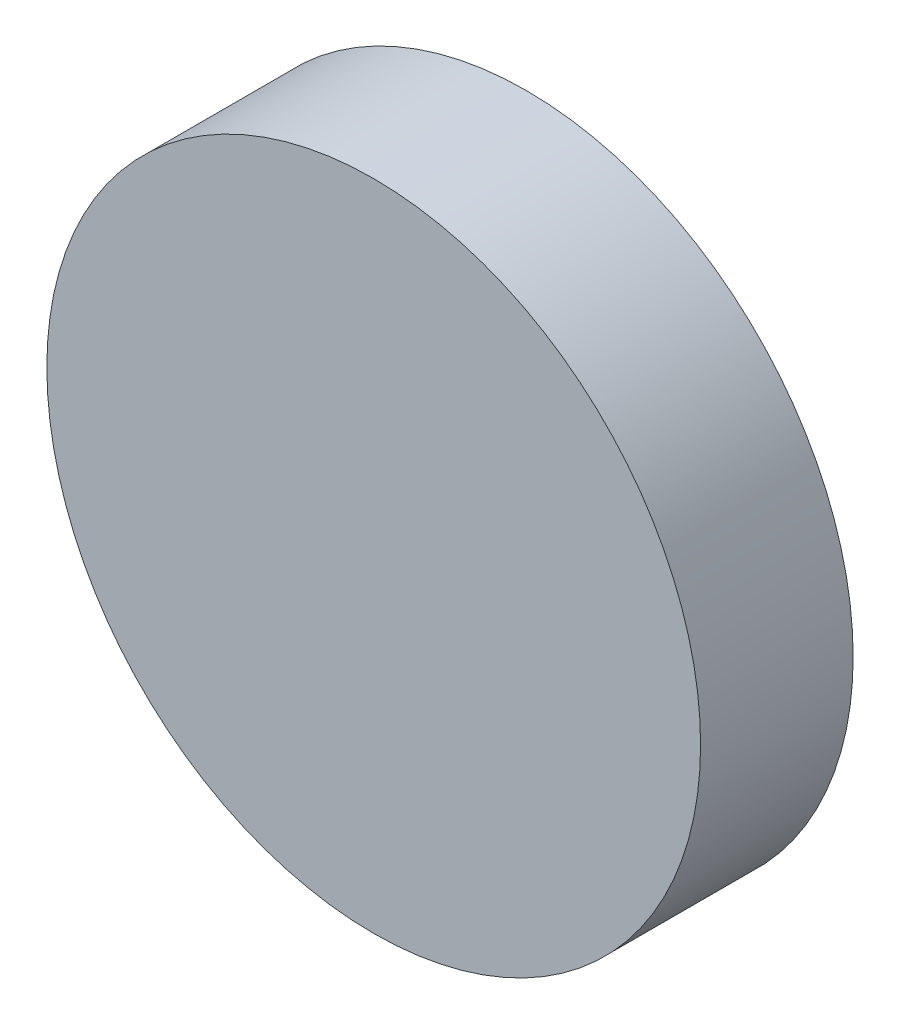
ISO-10303-21;
HEADER;
FILE_DESCRIPTION(('STEP AP214'),'2;1');
FILE_NAME('part.step','',(''),(''),'','','');
FILE_SCHEMA(('AUTOMOTIVE_DESIGN { 1 0 10303 214 1 1 1 1 }'));
ENDSEC;
DATA;
#1=APPLICATION_CONTEXT('core data for automotive mechanical design processes');
#2=APPLICATION_PROTOCOL_DEFINITION('international standard','automotive_design',2000,#1);
#3=PRODUCT_CONTEXT('',#1,'mechanical');
#4=PRODUCT('Part','Part','',(#3));
#5=PRODUCT_RELATED_PRODUCT_CATEGORY('part','',(#4));
#6=PRODUCT_DEFINITION_FORMATION('','',#4);
#7=PRODUCT_DEFINITION_CONTEXT('part definition',#1,'design');
#8=PRODUCT_DEFINITION('design','',#6,#7);
#9=PRODUCT_DEFINITION_SHAPE('','',#8);
#10=(LENGTH_UNIT() NAMED_UNIT(*) SI_UNIT(.MILLI.,.METRE.));
#11=(NAMED_UNIT(*) PLANE_ANGLE_UNIT() SI_UNIT($,.RADIAN.));
#12=(NAMED_UNIT(*) SI_UNIT($,.STERADIAN.) SOLID_ANGLE_UNIT());
#13=UNCERTAINTY_MEASURE_WITH_UNIT(LENGTH_MEASURE(1.E-05),#10,'distance_accuracy_value','');
#14=(GEOMETRIC_REPRESENTATION_CONTEXT(3) GLOBAL_UNCERTAINTY_ASSIGNED_CONTEXT((#13)) GLOBAL_UNIT_ASSIGNED_CONTEXT((#10,
#11,#12)) REPRESENTATION_CONTEXT('',''));
#15=CARTESIAN_POINT('',(0.,0.,0.));
#16=DIRECTION('',(0.,0.,1.));
#17=DIRECTION('',(1.,0.,0.));
#18=AXIS2_PLACEMENT_3D('',#15,#16,#17);
#19=CARTESIAN_POINT('',(0.,0.,5.08));
#20=DIRECTION('',(0.,0.,-1.));
#21=DIRECTION('',(-1.,0.,0.));
#22=AXIS2_PLACEMENT_3D('',#19,#20,#21);
#23=CYLINDRICAL_SURFACE('',#22,10.8839);
#24=CARTESIAN_POINT('',(0.,0.,5.08));
#25=DIRECTION('',(0.,0.,1.));
#26=DIRECTION('',(1.,0.,0.));
#27=AXIS2_PLACEMENT_3D('',#24,#25,#26);
#28=CIRCLE('',#27,10.8839);
#29=CARTESIAN_POINT('',(10.8839,0.,5.08));
#30=VERTEX_POINT('',#29);
#31=EDGE_CURVE('E43',#30,#30,#28,.T.);
#32=ORIENTED_EDGE('',*,*,#31,.F.);
#33=EDGE_LOOP('',(#32));
#34=FACE_BOUND('',#33,.T.);
#35=CARTESIAN_POINT('',(0.,0.,0.));
#36=DIRECTION('',(0.,0.,1.));
#37=DIRECTION('',(1.,0.,0.));
#38=AXIS2_PLACEMENT_3D('',#35,#36,#37);
#39=CIRCLE('',#38,10.8839);
#40=CARTESIAN_POINT('',(10.8839,0.,0.));
#41=VERTEX_POINT('',#40);
#42=EDGE_CURVE('E39',#41,#41,#39,.T.);
#43=ORIENTED_EDGE('',*,*,#42,.T.);
#44=EDGE_LOOP('',(#43));
#45=FACE_BOUND('',#44,.T.);
#46=ADVANCED_FACE('F38',(#34,#45),#23,.T.);
#47=CARTESIAN_POINT('',(0.,0.,5.08));
#48=DIRECTION('',(0.,0.,1.));
#49=DIRECTION('',(1.,0.,0.));
#50=AXIS2_PLACEMENT_3D('',#47,#48,#49);
#51=PLANE('',#50);
#52=ORIENTED_EDGE('',*,*,#31,.T.);
#53=EDGE_LOOP('',(#52));
#54=FACE_BOUND('',#53,.T.);
#55=ADVANCED_FACE('F58',(#54),#51,.T.);
#56=CARTESIAN_POINT('',(0.,0.,0.));
#57=DIRECTION('',(0.,0.,1.));
#58=DIRECTION('',(1.,0.,0.));
#59=AXIS2_PLACEMENT_3D('',#56,#57,#58);
#60=PLANE('',#59);
#61=CARTESIAN_POINT('',(0.,0.,0.));
#62=DIRECTION('',(0.,0.,-1.));
#63=DIRECTION('',(-1.,0.,0.));
#64=AXIS2_PLACEMENT_3D('',#61,#62,#63);
#65=CIRCLE('',#64,3.937);
#66=CARTESIAN_POINT('',(3.937,0.,0.));
#67=VERTEX_POINT('',#66);
#68=EDGE_CURVE('E10',#67,#67,#65,.T.);
#69=ORIENTED_EDGE('',*,*,#68,.F.);
#70=EDGE_LOOP('',(#69));
#71=FACE_BOUND('',#70,.T.);
#72=ORIENTED_EDGE('',*,*,#42,.F.);
#73=EDGE_LOOP('',(#72));
#74=FACE_BOUND('',#73,.T.);
#75=ADVANCED_FACE('F60',(#71,#74),#60,.F.);
#76=CARTESIAN_POINT('',(0.,0.,-3.302));
#77=DIRECTION('',(0.,0.,1.));
#78=DIRECTION('',(1.,0.,0.));
#79=AXIS2_PLACEMENT_3D('',#76,#77,#78);
#80=CYLINDRICAL_SURFACE('',#79,3.937);
#81=CARTESIAN_POINT('',(0.,0.,-3.302));
#82=DIRECTION('',(0.,0.,-1.));
#83=DIRECTION('',(-1.,0.,0.));
#84=AXIS2_PLACEMENT_3D('',#81,#82,#83);
#85=CIRCLE('',#84,3.937);
#86=CARTESIAN_POINT('',(3.937,0.,-3.302));
#87=VERTEX_POINT('',#86);
#88=EDGE_CURVE('E47',#87,#87,#85,.T.);
#89=CARTESIAN_POINT('',(3.937,0.,-3.302));
#90=CARTESIAN_POINT('',(3.937,0.,-3.26760416666667));
#91=CARTESIAN_POINT('',(3.937,0.,-3.23320833333333));
#92=CARTESIAN_POINT('',(3.937,0.,-3.16441666666667));
#93=CARTESIAN_POINT('',(3.937,0.,-3.13002083333333));
#94=CARTESIAN_POINT('',(3.937,0.,-3.06122916666667));
#95=CARTESIAN_POINT('',(3.937,0.,-3.02683333333333));
#96=CARTESIAN_POINT('',(3.937,0.,-2.95804166666667));
#97=CARTESIAN_POINT('',(3.937,0.,-2.92364583333333));
#98=CARTESIAN_POINT('',(3.937,0.,-2.85485416666667));
#99=CARTESIAN_POINT('',(3.937,0.,-2.82045833333333));
#100=CARTESIAN_POINT('',(3.937,0.,-2.75166666666667));
#101=CARTESIAN_POINT('',(3.937,0.,-2.71727083333333));
#102=CARTESIAN_POINT('',(3.937,0.,-2.64847916666667));
#103=CARTESIAN_POINT('',(3.937,0.,-2.61408333333333));
#104=CARTESIAN_POINT('',(3.937,0.,-2.54529166666667));
#105=CARTESIAN_POINT('',(3.937,0.,-2.51089583333333));
#106=CARTESIAN_POINT('',(3.937,0.,-2.44210416666667));
#107=CARTESIAN_POINT('',(3.937,0.,-2.40770833333333));
#108=CARTESIAN_POINT('',(3.937,0.,-2.33891666666667));
#109=CARTESIAN_POINT('',(3.937,0.,-2.30452083333333));
#110=CARTESIAN_POINT('',(3.937,0.,-2.23572916666667));
#111=CARTESIAN_POINT('',(3.937,0.,-2.20133333333333));
#112=CARTESIAN_POINT('',(3.937,0.,-2.13254166666667));
#113=CARTESIAN_POINT('',(3.937,0.,-2.09814583333333));
#114=CARTESIAN_POINT('',(3.937,0.,-2.02935416666667));
#115=CARTESIAN_POINT('',(3.937,0.,-1.99495833333333));
#116=CARTESIAN_POINT('',(3.937,0.,-1.92616666666667));
#117=CARTESIAN_POINT('',(3.937,0.,-1.89177083333333));
#118=CARTESIAN_POINT('',(3.937,0.,-1.82297916666667));
#119=CARTESIAN_POINT('',(3.937,0.,-1.78858333333333));
#120=CARTESIAN_POINT('',(3.937,0.,-1.71979166666667));
#121=CARTESIAN_POINT('',(3.937,0.,-1.68539583333333));
#122=CARTESIAN_POINT('',(3.937,0.,-1.61660416666667));
#123=CARTESIAN_POINT('',(3.937,0.,-1.58220833333333));
#124=CARTESIAN_POINT('',(3.937,0.,-1.51341666666667));
#125=CARTESIAN_POINT('',(3.937,0.,-1.47902083333333));
#126=CARTESIAN_POINT('',(3.937,0.,-1.41022916666667));
#127=CARTESIAN_POINT('',(3.937,0.,-1.37583333333333));
#128=CARTESIAN_POINT('',(3.937,0.,-1.30704166666667));
#129=CARTESIAN_POINT('',(3.937,0.,-1.27264583333333));
#130=CARTESIAN_POINT('',(3.937,0.,-1.20385416666667));
#131=CARTESIAN_POINT('',(3.937,0.,-1.16945833333333));
#132=CARTESIAN_POINT('',(3.937,0.,-1.10066666666667));
#133=CARTESIAN_POINT('',(3.937,0.,-1.06627083333333));
#134=CARTESIAN_POINT('',(3.937,0.,-0.997479166666667));
#135=CARTESIAN_POINT('',(3.937,0.,-0.963083333333334));
#136=CARTESIAN_POINT('',(3.937,0.,-0.894291666666667));
#137=CARTESIAN_POINT('',(3.937,0.,-0.859895833333333));
#138=CARTESIAN_POINT('',(3.937,0.,-0.791104166666666));
#139=CARTESIAN_POINT('',(3.937,0.,-0.756708333333333));
#140=CARTESIAN_POINT('',(3.937,0.,-0.687916666666667));
#141=CARTESIAN_POINT('',(3.937,0.,-0.653520833333333));
#142=CARTESIAN_POINT('',(3.937,0.,-0.584729166666667));
#143=CARTESIAN_POINT('',(3.937,0.,-0.550333333333333));
#144=CARTESIAN_POINT('',(3.937,0.,-0.481541666666667));
#145=CARTESIAN_POINT('',(3.937,0.,-0.447145833333333));
#146=CARTESIAN_POINT('',(3.937,0.,-0.378354166666667));
#147=CARTESIAN_POINT('',(3.937,0.,-0.343958333333333));
#148=CARTESIAN_POINT('',(3.937,0.,-0.275166666666667));
#149=CARTESIAN_POINT('',(3.937,0.,-0.240770833333333));
#150=CARTESIAN_POINT('',(3.937,0.,-0.171979166666667));
#151=CARTESIAN_POINT('',(3.937,0.,-0.137583333333333));
#152=CARTESIAN_POINT('',(3.937,0.,-0.0687916666666666));
#153=CARTESIAN_POINT('',(3.937,0.,-0.0343958333333333));
#154=CARTESIAN_POINT('',(3.937,0.,0.));
#155=B_SPLINE_CURVE_WITH_KNOTS('',3,(#89,#90,#91,#92,#93,#94,#95,#96,#97,#98,#99,#100,#101,#102,
#103,#104,#105,#106,#107,#108,#109,#110,#111,#112,#113,#114,#115,#116,#117,#118,#119,#120,#121,
#122,#123,#124,#125,#126,#127,#128,#129,#130,#131,#132,#133,#134,#135,#136,#137,#138,#139,#140,
#141,#142,#143,#144,#145,#146,#147,#148,#149,#150,#151,#152,#153,#154),.UNSPECIFIED.,.F.,.F.,(4,
2,2,2,2,2,2,2,2,2,2,2,2,2,2,2,2,2,2,2,2,2,2,2,2,2,2,2,2,2,2,2,4),(0.,0.1031875,0.206375,
0.3095625,0.41275,0.5159375,0.619125,0.7223125,0.8255,0.9286875,1.031875,1.1350625,1.23825,
1.3414375,1.444625,1.5478125,1.651,1.7541875,1.857375,1.9605625,2.06375,2.1669375,2.270125,
2.3733125,2.4765,2.5796875,2.682875,2.7860625,2.88925,2.9924375,3.095625,3.1988125,3.302),.UNSPECIFIED.);
#156=EDGE_CURVE('BSEAM56',#87,#67,#155,.T.);
#157=ORIENTED_EDGE('',*,*,#88,.F.);
#158=ORIENTED_EDGE('',*,*,#68,.T.);
#159=ORIENTED_EDGE('',*,*,#156,.T.);
#160=ORIENTED_EDGE('',*,*,#156,.F.);
#161=EDGE_LOOP('',(#157,#159,#158,#160));
#162=FACE_BOUND('',#161,.T.);
#163=ADVANCED_FACE('F56',(#162),#80,.T.);
#164=CARTESIAN_POINT('',(0.,0.,-3.302));
#165=DIRECTION('',(0.,0.,-1.));
#166=DIRECTION('',(-1.,0.,0.));
#167=AXIS2_PLACEMENT_3D('',#164,#165,#166);
#168=PLANE('',#167);
#169=ORIENTED_EDGE('',*,*,#88,.T.);
#170=EDGE_LOOP('',(#169));
#171=FACE_BOUND('',#170,.T.);
#172=ADVANCED_FACE('F67',(#171),#168,.T.);
#173=CLOSED_SHELL('',(#46,#55,#75,#163,#172));
#174=MANIFOLD_SOLID_BREP('B2',#173);
#175=ADVANCED_BREP_SHAPE_REPRESENTATION('',(#18,#174),#14);
#176=SHAPE_DEFINITION_REPRESENTATION(#9,#175);
ENDSEC;
END-ISO-10303-21;
